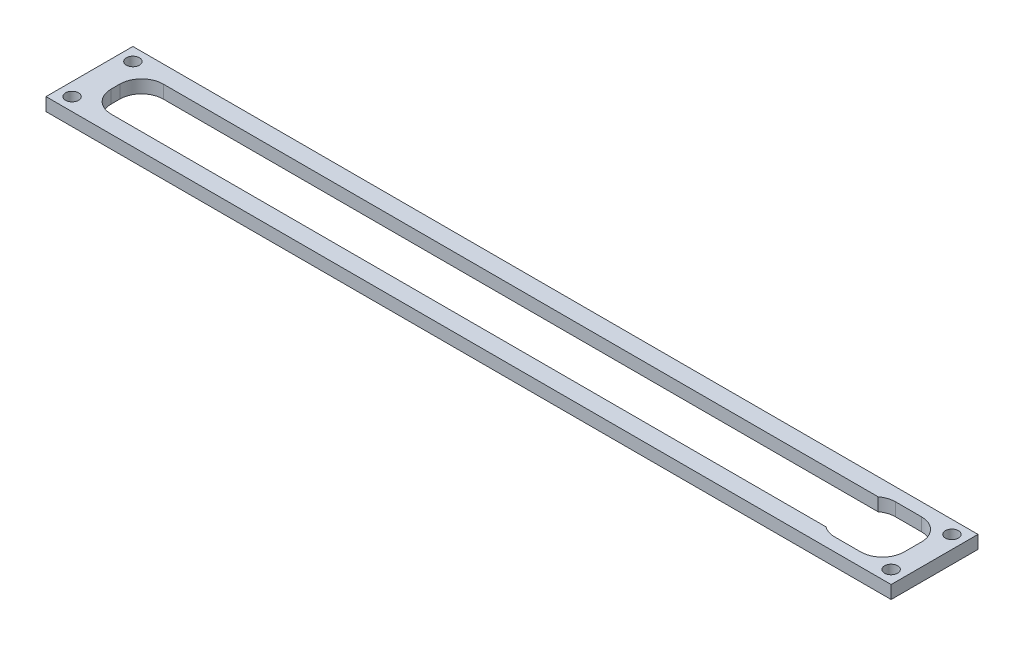
ISO-10303-21;
HEADER;
FILE_DESCRIPTION(('STEP AP214'),'2;1');
FILE_NAME('part.step','',(''),(''),'','','');
FILE_SCHEMA(('AUTOMOTIVE_DESIGN { 1 0 10303 214 1 1 1 1 }'));
ENDSEC;
DATA;
#1=APPLICATION_CONTEXT('core data for automotive mechanical design processes');
#2=APPLICATION_PROTOCOL_DEFINITION('international standard','automotive_design',2000,#1);
#3=PRODUCT_CONTEXT('',#1,'mechanical');
#4=PRODUCT('Part','Part','',(#3));
#5=PRODUCT_RELATED_PRODUCT_CATEGORY('part','',(#4));
#6=PRODUCT_DEFINITION_FORMATION('','',#4);
#7=PRODUCT_DEFINITION_CONTEXT('part definition',#1,'design');
#8=PRODUCT_DEFINITION('design','',#6,#7);
#9=PRODUCT_DEFINITION_SHAPE('','',#8);
#10=(LENGTH_UNIT() NAMED_UNIT(*) SI_UNIT(.MILLI.,.METRE.));
#11=(NAMED_UNIT(*) PLANE_ANGLE_UNIT() SI_UNIT($,.RADIAN.));
#12=(NAMED_UNIT(*) SI_UNIT($,.STERADIAN.) SOLID_ANGLE_UNIT());
#13=UNCERTAINTY_MEASURE_WITH_UNIT(LENGTH_MEASURE(1.E-05),#10,'distance_accuracy_value','');
#14=(GEOMETRIC_REPRESENTATION_CONTEXT(3) GLOBAL_UNCERTAINTY_ASSIGNED_CONTEXT((#13)) GLOBAL_UNIT_ASSIGNED_CONTEXT((#10,
#11,#12)) REPRESENTATION_CONTEXT('',''));
#15=CARTESIAN_POINT('',(0.,0.,0.));
#16=DIRECTION('',(0.,0.,1.));
#17=DIRECTION('',(1.,0.,0.));
#18=AXIS2_PLACEMENT_3D('',#15,#16,#17);
#19=CARTESIAN_POINT('',(0.,3.,0.));
#20=DIRECTION('',(0.,-1.,0.));
#21=DIRECTION('',(0.,0.,-1.));
#22=AXIS2_PLACEMENT_3D('',#19,#20,#21);
#23=PLANE('',#22);
#24=DIRECTION('',(0.,0.,1.));
#25=VECTOR('',#24,1.);
#26=CARTESIAN_POINT('',(0.,3.,0.));
#27=LINE('',#26,#25);
#28=CARTESIAN_POINT('',(0.,3.,-20.));
#29=VERTEX_POINT('',#28);
#30=CARTESIAN_POINT('',(0.,3.,0.));
#31=VERTEX_POINT('',#30);
#32=EDGE_CURVE('E252',#29,#31,#27,.T.);
#33=ORIENTED_EDGE('',*,*,#32,.T.);
#34=DIRECTION('',(1.,0.,0.));
#35=VECTOR('',#34,1.);
#36=CARTESIAN_POINT('',(0.,3.,0.));
#37=LINE('',#36,#35);
#38=CARTESIAN_POINT('',(194.591670796805,3.,0.));
#39=VERTEX_POINT('',#38);
#40=EDGE_CURVE('E255',#31,#39,#37,.T.);
#41=ORIENTED_EDGE('',*,*,#40,.T.);
#42=DIRECTION('',(0.,0.,-1.));
#43=VECTOR('',#42,1.);
#44=CARTESIAN_POINT('',(194.591670796805,3.,0.));
#45=LINE('',#44,#43);
#46=CARTESIAN_POINT('',(194.591670796805,3.,-20.));
#47=VERTEX_POINT('',#46);
#48=EDGE_CURVE('E258',#39,#47,#45,.T.);
#49=ORIENTED_EDGE('',*,*,#48,.T.);
#50=DIRECTION('',(-1.,0.,0.));
#51=VECTOR('',#50,1.);
#52=CARTESIAN_POINT('',(0.,3.,-20.));
#53=LINE('',#52,#51);
#54=EDGE_CURVE('E260',#47,#29,#53,.T.);
#55=ORIENTED_EDGE('',*,*,#54,.T.);
#56=EDGE_LOOP('',(#33,#41,#49,#55));
#57=FACE_BOUND('',#56,.T.);
#58=DIRECTION('',(-1.,0.,0.));
#59=VECTOR('',#58,1.);
#60=CARTESIAN_POINT('',(5.99999999999999,3.,-16.));
#61=LINE('',#60,#59);
#62=CARTESIAN_POINT('',(175.591670796805,3.,-16.));
#63=VERTEX_POINT('',#62);
#64=CARTESIAN_POINT('',(11.,3.,-16.));
#65=VERTEX_POINT('',#64);
#66=EDGE_CURVE('E245',#63,#65,#61,.T.);
#67=ORIENTED_EDGE('',*,*,#66,.F.);
#68=CARTESIAN_POINT('',(178.591670796805,3.,-12.));
#69=DIRECTION('',(0.,-1.,0.));
#70=DIRECTION('',(0.,0.,-1.));
#71=AXIS2_PLACEMENT_3D('',#68,#69,#70);
#72=CIRCLE('',#71,5.);
#73=CARTESIAN_POINT('',(178.591670796805,3.,-17.));
#74=VERTEX_POINT('',#73);
#75=EDGE_CURVE('E195',#63,#74,#72,.T.);
#76=ORIENTED_EDGE('',*,*,#75,.T.);
#77=DIRECTION('',(-1.,0.,0.));
#78=VECTOR('',#77,1.);
#79=CARTESIAN_POINT('',(175.591670796805,3.,-17.));
#80=LINE('',#79,#78);
#81=CARTESIAN_POINT('',(184.591670796805,3.,-17.));
#82=VERTEX_POINT('',#81);
#83=EDGE_CURVE('E207',#82,#74,#80,.T.);
#84=ORIENTED_EDGE('',*,*,#83,.F.);
#85=CARTESIAN_POINT('',(184.591670796805,3.,-12.));
#86=DIRECTION('',(0.,-1.,0.));
#87=DIRECTION('',(0.,0.,-1.));
#88=AXIS2_PLACEMENT_3D('',#85,#86,#87);
#89=CIRCLE('',#88,5.);
#90=CARTESIAN_POINT('',(189.591670796805,3.,-12.));
#91=VERTEX_POINT('',#90);
#92=EDGE_CURVE('E187',#82,#91,#89,.T.);
#93=ORIENTED_EDGE('',*,*,#92,.T.);
#94=DIRECTION('',(0.,0.,-1.));
#95=VECTOR('',#94,1.);
#96=CARTESIAN_POINT('',(189.591670796805,3.,-17.));
#97=LINE('',#96,#95);
#98=CARTESIAN_POINT('',(189.591670796805,3.,-8.00000000000001));
#99=VERTEX_POINT('',#98);
#100=EDGE_CURVE('E204',#99,#91,#97,.T.);
#101=ORIENTED_EDGE('',*,*,#100,.F.);
#102=CARTESIAN_POINT('',(184.591670796805,3.,-8.00000000000001));
#103=DIRECTION('',(0.,-1.,0.));
#104=DIRECTION('',(0.,0.,-1.));
#105=AXIS2_PLACEMENT_3D('',#102,#103,#104);
#106=CIRCLE('',#105,5.);
#107=CARTESIAN_POINT('',(184.591670796805,3.,-3.00000000000001));
#108=VERTEX_POINT('',#107);
#109=EDGE_CURVE('E191',#99,#108,#106,.T.);
#110=ORIENTED_EDGE('',*,*,#109,.T.);
#111=DIRECTION('',(1.,0.,0.));
#112=VECTOR('',#111,1.);
#113=CARTESIAN_POINT('',(175.591670796805,3.,-3.00000000000001));
#114=LINE('',#113,#112);
#115=CARTESIAN_POINT('',(178.591670796805,3.,-3.00000000000001));
#116=VERTEX_POINT('',#115);
#117=EDGE_CURVE('E202',#116,#108,#114,.T.);
#118=ORIENTED_EDGE('',*,*,#117,.F.);
#119=CARTESIAN_POINT('',(178.591670796805,3.,-8.00000000000001));
#120=DIRECTION('',(0.,-1.,0.));
#121=DIRECTION('',(0.,0.,-1.));
#122=AXIS2_PLACEMENT_3D('',#119,#120,#121);
#123=CIRCLE('',#122,5.);
#124=CARTESIAN_POINT('',(175.591670796805,3.,-4.00000000000002));
#125=VERTEX_POINT('',#124);
#126=EDGE_CURVE('E45',#116,#125,#123,.T.);
#127=ORIENTED_EDGE('',*,*,#126,.T.);
#128=DIRECTION('',(1.,0.,0.));
#129=VECTOR('',#128,1.);
#130=CARTESIAN_POINT('',(5.99999999999999,3.,-4.00000000000002));
#131=LINE('',#130,#129);
#132=CARTESIAN_POINT('',(11.,3.,-4.00000000000002));
#133=VERTEX_POINT('',#132);
#134=EDGE_CURVE('E164',#133,#125,#131,.T.);
#135=ORIENTED_EDGE('',*,*,#134,.F.);
#136=CARTESIAN_POINT('',(11.,3.,-9.00000000000001));
#137=DIRECTION('',(0.,-1.,0.));
#138=DIRECTION('',(0.,0.,-1.));
#139=AXIS2_PLACEMENT_3D('',#136,#137,#138);
#140=CIRCLE('',#139,5.);
#141=CARTESIAN_POINT('',(5.99999999999999,3.,-9.00000000000001));
#142=VERTEX_POINT('',#141);
#143=EDGE_CURVE('E181',#133,#142,#140,.T.);
#144=ORIENTED_EDGE('',*,*,#143,.T.);
#145=DIRECTION('',(0.,0.,1.));
#146=VECTOR('',#145,1.);
#147=CARTESIAN_POINT('',(5.99999999999999,3.,-16.));
#148=LINE('',#147,#146);
#149=CARTESIAN_POINT('',(5.99999999999999,3.,-11.));
#150=VERTEX_POINT('',#149);
#151=EDGE_CURVE('E241',#150,#142,#148,.T.);
#152=ORIENTED_EDGE('',*,*,#151,.F.);
#153=CARTESIAN_POINT('',(11.,3.,-11.));
#154=DIRECTION('',(0.,-1.,0.));
#155=DIRECTION('',(0.,0.,-1.));
#156=AXIS2_PLACEMENT_3D('',#153,#154,#155);
#157=CIRCLE('',#156,5.);
#158=EDGE_CURVE('E185',#150,#65,#157,.T.);
#159=ORIENTED_EDGE('',*,*,#158,.T.);
#160=EDGE_LOOP('',(#67,#76,#84,#93,#101,#110,#118,#127,#135,#144,#152,#159));
#161=FACE_BOUND('',#160,.T.);
#162=CARTESIAN_POINT('',(3.,3.,-17.));
#163=DIRECTION('',(0.,1.,0.));
#164=DIRECTION('',(0.,0.,1.));
#165=AXIS2_PLACEMENT_3D('',#162,#163,#164);
#166=CIRCLE('',#165,1.5);
#167=CARTESIAN_POINT('',(3.,3.,-15.5));
#168=VERTEX_POINT('',#167);
#169=EDGE_CURVE('E236',#168,#168,#166,.T.);
#170=ORIENTED_EDGE('',*,*,#169,.F.);
#171=EDGE_LOOP('',(#170));
#172=FACE_BOUND('',#171,.T.);
#173=CARTESIAN_POINT('',(3.,3.,-3.));
#174=DIRECTION('',(0.,1.,0.));
#175=DIRECTION('',(0.,0.,-1.));
#176=AXIS2_PLACEMENT_3D('',#173,#174,#175);
#177=CIRCLE('',#176,1.5);
#178=CARTESIAN_POINT('',(3.,3.,-4.5));
#179=VERTEX_POINT('',#178);
#180=EDGE_CURVE('E230',#179,#179,#177,.T.);
#181=ORIENTED_EDGE('',*,*,#180,.F.);
#182=EDGE_LOOP('',(#181));
#183=FACE_BOUND('',#182,.T.);
#184=CARTESIAN_POINT('',(191.591670796805,3.,-3.00000000000002));
#185=DIRECTION('',(0.,1.,0.));
#186=DIRECTION('',(0.,0.,1.));
#187=AXIS2_PLACEMENT_3D('',#184,#185,#186);
#188=CIRCLE('',#187,1.5);
#189=CARTESIAN_POINT('',(191.591670796805,3.,-1.50000000000002));
#190=VERTEX_POINT('',#189);
#191=EDGE_CURVE('E224',#190,#190,#188,.T.);
#192=ORIENTED_EDGE('',*,*,#191,.F.);
#193=EDGE_LOOP('',(#192));
#194=FACE_BOUND('',#193,.T.);
#195=CARTESIAN_POINT('',(191.591670796805,3.,-17.0000000000001));
#196=DIRECTION('',(0.,1.,0.));
#197=DIRECTION('',(0.,0.,-1.));
#198=AXIS2_PLACEMENT_3D('',#195,#196,#197);
#199=CIRCLE('',#198,1.5);
#200=CARTESIAN_POINT('',(191.591670796805,3.,-18.5000000000001));
#201=VERTEX_POINT('',#200);
#202=EDGE_CURVE('E218',#201,#201,#199,.T.);
#203=ORIENTED_EDGE('',*,*,#202,.F.);
#204=EDGE_LOOP('',(#203));
#205=FACE_BOUND('',#204,.T.);
#206=ADVANCED_FACE('F37',(#57,#161,#172,#183,#194,#205),#23,.F.);
#207=CARTESIAN_POINT('',(0.,0.,0.));
#208=DIRECTION('',(0.,-1.,0.));
#209=DIRECTION('',(0.,0.,-1.));
#210=AXIS2_PLACEMENT_3D('',#207,#208,#209);
#211=PLANE('',#210);
#212=DIRECTION('',(-1.,0.,0.));
#213=VECTOR('',#212,1.);
#214=CARTESIAN_POINT('',(175.591670796805,0.,-17.));
#215=LINE('',#214,#213);
#216=CARTESIAN_POINT('',(184.591670796805,0.,-17.));
#217=VERTEX_POINT('',#216);
#218=CARTESIAN_POINT('',(178.591670796805,0.,-17.));
#219=VERTEX_POINT('',#218);
#220=EDGE_CURVE('E167',#217,#219,#215,.T.);
#221=ORIENTED_EDGE('',*,*,#220,.T.);
#222=CARTESIAN_POINT('',(178.591670796805,0.,-12.));
#223=DIRECTION('',(0.,-1.,0.));
#224=DIRECTION('',(0.,0.,-1.));
#225=AXIS2_PLACEMENT_3D('',#222,#223,#224);
#226=CIRCLE('',#225,5.);
#227=CARTESIAN_POINT('',(175.591670796805,0.,-16.));
#228=VERTEX_POINT('',#227);
#229=EDGE_CURVE('E197',#219,#228,#226,.F.);
#230=ORIENTED_EDGE('',*,*,#229,.T.);
#231=DIRECTION('',(-1.,0.,0.));
#232=VECTOR('',#231,1.);
#233=CARTESIAN_POINT('',(5.99999999999999,0.,-16.));
#234=LINE('',#233,#232);
#235=CARTESIAN_POINT('',(11.,0.,-16.));
#236=VERTEX_POINT('',#235);
#237=EDGE_CURVE('E156',#228,#236,#234,.T.);
#238=ORIENTED_EDGE('',*,*,#237,.T.);
#239=CARTESIAN_POINT('',(11.,0.,-11.));
#240=DIRECTION('',(0.,-1.,0.));
#241=DIRECTION('',(0.,0.,-1.));
#242=AXIS2_PLACEMENT_3D('',#239,#240,#241);
#243=CIRCLE('',#242,5.);
#244=CARTESIAN_POINT('',(5.99999999999999,0.,-11.));
#245=VERTEX_POINT('',#244);
#246=EDGE_CURVE('E183',#236,#245,#243,.F.);
#247=ORIENTED_EDGE('',*,*,#246,.T.);
#248=DIRECTION('',(0.,0.,1.));
#249=VECTOR('',#248,1.);
#250=CARTESIAN_POINT('',(5.99999999999999,0.,-16.));
#251=LINE('',#250,#249);
#252=CARTESIAN_POINT('',(5.99999999999999,0.,-9.00000000000001));
#253=VERTEX_POINT('',#252);
#254=EDGE_CURVE('E157',#245,#253,#251,.T.);
#255=ORIENTED_EDGE('',*,*,#254,.T.);
#256=CARTESIAN_POINT('',(11.,0.,-9.00000000000001));
#257=DIRECTION('',(0.,-1.,0.));
#258=DIRECTION('',(0.,0.,-1.));
#259=AXIS2_PLACEMENT_3D('',#256,#257,#258);
#260=CIRCLE('',#259,5.);
#261=CARTESIAN_POINT('',(11.,0.,-4.00000000000002));
#262=VERTEX_POINT('',#261);
#263=EDGE_CURVE('E153',#253,#262,#260,.F.);
#264=ORIENTED_EDGE('',*,*,#263,.T.);
#265=DIRECTION('',(1.,0.,0.));
#266=VECTOR('',#265,1.);
#267=CARTESIAN_POINT('',(5.99999999999999,0.,-4.00000000000002));
#268=LINE('',#267,#266);
#269=CARTESIAN_POINT('',(175.591670796805,0.,-4.00000000000002));
#270=VERTEX_POINT('',#269);
#271=EDGE_CURVE('E147',#262,#270,#268,.T.);
#272=ORIENTED_EDGE('',*,*,#271,.T.);
#273=CARTESIAN_POINT('',(178.591670796805,0.,-8.00000000000001));
#274=DIRECTION('',(0.,-1.,0.));
#275=DIRECTION('',(0.,0.,-1.));
#276=AXIS2_PLACEMENT_3D('',#273,#274,#275);
#277=CIRCLE('',#276,5.);
#278=CARTESIAN_POINT('',(178.591670796805,0.,-3.00000000000001));
#279=VERTEX_POINT('',#278);
#280=EDGE_CURVE('E11',#270,#279,#277,.F.);
#281=ORIENTED_EDGE('',*,*,#280,.T.);
#282=DIRECTION('',(1.,0.,0.));
#283=VECTOR('',#282,1.);
#284=CARTESIAN_POINT('',(175.591670796805,0.,-3.00000000000001));
#285=LINE('',#284,#283);
#286=CARTESIAN_POINT('',(184.591670796805,0.,-3.00000000000001));
#287=VERTEX_POINT('',#286);
#288=EDGE_CURVE('E214',#279,#287,#285,.T.);
#289=ORIENTED_EDGE('',*,*,#288,.T.);
#290=CARTESIAN_POINT('',(184.591670796805,0.,-8.00000000000001));
#291=DIRECTION('',(0.,-1.,0.));
#292=DIRECTION('',(0.,0.,-1.));
#293=AXIS2_PLACEMENT_3D('',#290,#291,#292);
#294=CIRCLE('',#293,5.);
#295=CARTESIAN_POINT('',(189.591670796805,0.,-8.00000000000001));
#296=VERTEX_POINT('',#295);
#297=EDGE_CURVE('E193',#287,#296,#294,.F.);
#298=ORIENTED_EDGE('',*,*,#297,.T.);
#299=DIRECTION('',(0.,0.,-1.));
#300=VECTOR('',#299,1.);
#301=CARTESIAN_POINT('',(189.591670796805,0.,-17.));
#302=LINE('',#301,#300);
#303=CARTESIAN_POINT('',(189.591670796805,0.,-12.));
#304=VERTEX_POINT('',#303);
#305=EDGE_CURVE('E302',#296,#304,#302,.T.);
#306=ORIENTED_EDGE('',*,*,#305,.T.);
#307=CARTESIAN_POINT('',(184.591670796805,0.,-12.));
#308=DIRECTION('',(0.,-1.,0.));
#309=DIRECTION('',(0.,0.,-1.));
#310=AXIS2_PLACEMENT_3D('',#307,#308,#309);
#311=CIRCLE('',#310,5.);
#312=EDGE_CURVE('E189',#304,#217,#311,.F.);
#313=ORIENTED_EDGE('',*,*,#312,.T.);
#314=EDGE_LOOP('',(#221,#230,#238,#247,#255,#264,#272,#281,#289,#298,#306,#313));
#315=FACE_BOUND('',#314,.T.);
#316=CARTESIAN_POINT('',(191.591670796805,0.,-3.00000000000002));
#317=DIRECTION('',(0.,1.,0.));
#318=DIRECTION('',(0.,0.,1.));
#319=AXIS2_PLACEMENT_3D('',#316,#317,#318);
#320=CIRCLE('',#319,1.5);
#321=CARTESIAN_POINT('',(191.591670796805,0.,-1.50000000000002));
#322=VERTEX_POINT('',#321);
#323=EDGE_CURVE('E221',#322,#322,#320,.T.);
#324=ORIENTED_EDGE('',*,*,#323,.T.);
#325=EDGE_LOOP('',(#324));
#326=FACE_BOUND('',#325,.T.);
#327=CARTESIAN_POINT('',(3.,0.,-17.));
#328=DIRECTION('',(0.,1.,0.));
#329=DIRECTION('',(0.,0.,1.));
#330=AXIS2_PLACEMENT_3D('',#327,#328,#329);
#331=CIRCLE('',#330,1.5);
#332=CARTESIAN_POINT('',(3.,0.,-15.5));
#333=VERTEX_POINT('',#332);
#334=EDGE_CURVE('E233',#333,#333,#331,.T.);
#335=ORIENTED_EDGE('',*,*,#334,.T.);
#336=EDGE_LOOP('',(#335));
#337=FACE_BOUND('',#336,.T.);
#338=DIRECTION('',(0.,0.,1.));
#339=VECTOR('',#338,1.);
#340=CARTESIAN_POINT('',(0.,0.,0.));
#341=LINE('',#340,#339);
#342=CARTESIAN_POINT('',(0.,0.,-20.));
#343=VERTEX_POINT('',#342);
#344=CARTESIAN_POINT('',(0.,0.,0.));
#345=VERTEX_POINT('',#344);
#346=EDGE_CURVE('E248',#343,#345,#341,.T.);
#347=ORIENTED_EDGE('',*,*,#346,.F.);
#348=DIRECTION('',(-1.,0.,0.));
#349=VECTOR('',#348,1.);
#350=CARTESIAN_POINT('',(0.,0.,-20.));
#351=LINE('',#350,#349);
#352=CARTESIAN_POINT('',(194.591670796805,0.,-20.));
#353=VERTEX_POINT('',#352);
#354=EDGE_CURVE('E256',#353,#343,#351,.T.);
#355=ORIENTED_EDGE('',*,*,#354,.F.);
#356=DIRECTION('',(0.,0.,-1.));
#357=VECTOR('',#356,1.);
#358=CARTESIAN_POINT('',(194.591670796805,0.,0.));
#359=LINE('',#358,#357);
#360=CARTESIAN_POINT('',(194.591670796805,0.,0.));
#361=VERTEX_POINT('',#360);
#362=EDGE_CURVE('E267',#361,#353,#359,.T.);
#363=ORIENTED_EDGE('',*,*,#362,.F.);
#364=DIRECTION('',(1.,0.,0.));
#365=VECTOR('',#364,1.);
#366=CARTESIAN_POINT('',(0.,0.,0.));
#367=LINE('',#366,#365);
#368=EDGE_CURVE('E265',#345,#361,#367,.T.);
#369=ORIENTED_EDGE('',*,*,#368,.F.);
#370=EDGE_LOOP('',(#347,#355,#363,#369));
#371=FACE_BOUND('',#370,.T.);
#372=CARTESIAN_POINT('',(3.,0.,-3.));
#373=DIRECTION('',(0.,1.,0.));
#374=DIRECTION('',(0.,0.,-1.));
#375=AXIS2_PLACEMENT_3D('',#372,#373,#374);
#376=CIRCLE('',#375,1.5);
#377=CARTESIAN_POINT('',(3.,0.,-4.5));
#378=VERTEX_POINT('',#377);
#379=EDGE_CURVE('E227',#378,#378,#376,.T.);
#380=ORIENTED_EDGE('',*,*,#379,.T.);
#381=EDGE_LOOP('',(#380));
#382=FACE_BOUND('',#381,.T.);
#383=CARTESIAN_POINT('',(191.591670796805,0.,-17.0000000000001));
#384=DIRECTION('',(0.,1.,0.));
#385=DIRECTION('',(0.,0.,-1.));
#386=AXIS2_PLACEMENT_3D('',#383,#384,#385);
#387=CIRCLE('',#386,1.5);
#388=CARTESIAN_POINT('',(191.591670796805,0.,-18.5000000000001));
#389=VERTEX_POINT('',#388);
#390=EDGE_CURVE('E216',#389,#389,#387,.T.);
#391=ORIENTED_EDGE('',*,*,#390,.T.);
#392=EDGE_LOOP('',(#391));
#393=FACE_BOUND('',#392,.T.);
#394=ADVANCED_FACE('F150',(#315,#326,#337,#371,#382,#393),#211,.T.);
#395=CARTESIAN_POINT('',(0.,3.,0.));
#396=DIRECTION('',(1.,0.,0.));
#397=DIRECTION('',(0.,0.,-1.));
#398=AXIS2_PLACEMENT_3D('',#395,#396,#397);
#399=PLANE('',#398);
#400=ORIENTED_EDGE('',*,*,#346,.T.);
#401=DIRECTION('',(0.,-1.,0.));
#402=VECTOR('',#401,1.);
#403=CARTESIAN_POINT('',(0.,3.,0.));
#404=LINE('',#403,#402);
#405=EDGE_CURVE('E278',#31,#345,#404,.T.);
#406=ORIENTED_EDGE('',*,*,#405,.F.);
#407=ORIENTED_EDGE('',*,*,#32,.F.);
#408=DIRECTION('',(0.,-1.,0.));
#409=VECTOR('',#408,1.);
#410=CARTESIAN_POINT('',(0.,3.,-20.));
#411=LINE('',#410,#409);
#412=EDGE_CURVE('E262',#29,#343,#411,.T.);
#413=ORIENTED_EDGE('',*,*,#412,.T.);
#414=EDGE_LOOP('',(#400,#406,#407,#413));
#415=FACE_BOUND('',#414,.T.);
#416=ADVANCED_FACE('F333',(#415),#399,.F.);
#417=CARTESIAN_POINT('',(0.,3.,0.));
#418=DIRECTION('',(0.,0.,-1.));
#419=DIRECTION('',(-1.,0.,0.));
#420=AXIS2_PLACEMENT_3D('',#417,#418,#419);
#421=PLANE('',#420);
#422=ORIENTED_EDGE('',*,*,#368,.T.);
#423=DIRECTION('',(0.,-1.,0.));
#424=VECTOR('',#423,1.);
#425=CARTESIAN_POINT('',(194.591670796805,3.,0.));
#426=LINE('',#425,#424);
#427=EDGE_CURVE('E275',#39,#361,#426,.T.);
#428=ORIENTED_EDGE('',*,*,#427,.F.);
#429=ORIENTED_EDGE('',*,*,#40,.F.);
#430=ORIENTED_EDGE('',*,*,#405,.T.);
#431=EDGE_LOOP('',(#422,#428,#429,#430));
#432=FACE_BOUND('',#431,.T.);
#433=ADVANCED_FACE('F346',(#432),#421,.F.);
#434=CARTESIAN_POINT('',(194.591670796805,3.,0.));
#435=DIRECTION('',(-1.,0.,0.));
#436=DIRECTION('',(0.,0.,1.));
#437=AXIS2_PLACEMENT_3D('',#434,#435,#436);
#438=PLANE('',#437);
#439=ORIENTED_EDGE('',*,*,#362,.T.);
#440=DIRECTION('',(0.,-1.,0.));
#441=VECTOR('',#440,1.);
#442=CARTESIAN_POINT('',(194.591670796805,3.,-20.));
#443=LINE('',#442,#441);
#444=EDGE_CURVE('E272',#47,#353,#443,.T.);
#445=ORIENTED_EDGE('',*,*,#444,.F.);
#446=ORIENTED_EDGE('',*,*,#48,.F.);
#447=ORIENTED_EDGE('',*,*,#427,.T.);
#448=EDGE_LOOP('',(#439,#445,#446,#447));
#449=FACE_BOUND('',#448,.T.);
#450=ADVANCED_FACE('F342',(#449),#438,.F.);
#451=CARTESIAN_POINT('',(0.,3.,-20.));
#452=DIRECTION('',(0.,0.,1.));
#453=DIRECTION('',(1.,0.,0.));
#454=AXIS2_PLACEMENT_3D('',#451,#452,#453);
#455=PLANE('',#454);
#456=ORIENTED_EDGE('',*,*,#354,.T.);
#457=ORIENTED_EDGE('',*,*,#412,.F.);
#458=ORIENTED_EDGE('',*,*,#54,.F.);
#459=ORIENTED_EDGE('',*,*,#444,.T.);
#460=EDGE_LOOP('',(#456,#457,#458,#459));
#461=FACE_BOUND('',#460,.T.);
#462=ADVANCED_FACE('F339',(#461),#455,.F.);
#463=CARTESIAN_POINT('',(5.99999999999999,3.,-16.));
#464=DIRECTION('',(1.,0.,0.));
#465=DIRECTION('',(0.,0.,-1.));
#466=AXIS2_PLACEMENT_3D('',#463,#464,#465);
#467=PLANE('',#466);
#468=ORIENTED_EDGE('',*,*,#151,.T.);
#469=DIRECTION('',(0.,-1.,0.));
#470=VECTOR('',#469,1.);
#471=CARTESIAN_POINT('',(5.99999999999999,0.,-9.00000000000001));
#472=LINE('',#471,#470);
#473=EDGE_CURVE('E283',#142,#253,#472,.T.);
#474=ORIENTED_EDGE('',*,*,#473,.T.);
#475=ORIENTED_EDGE('',*,*,#254,.F.);
#476=DIRECTION('',(0.,-1.,0.));
#477=VECTOR('',#476,1.);
#478=CARTESIAN_POINT('',(5.99999999999999,3.,-11.));
#479=LINE('',#478,#477);
#480=EDGE_CURVE('E281',#245,#150,#479,.F.);
#481=ORIENTED_EDGE('',*,*,#480,.T.);
#482=EDGE_LOOP('',(#468,#474,#475,#481));
#483=FACE_BOUND('',#482,.T.);
#484=ADVANCED_FACE('F336',(#483),#467,.T.);
#485=CARTESIAN_POINT('',(5.99999999999999,3.,-4.00000000000002));
#486=DIRECTION('',(0.,0.,-1.));
#487=DIRECTION('',(-1.,0.,0.));
#488=AXIS2_PLACEMENT_3D('',#485,#486,#487);
#489=PLANE('',#488);
#490=ORIENTED_EDGE('',*,*,#271,.F.);
#491=DIRECTION('',(0.,-1.,0.));
#492=VECTOR('',#491,1.);
#493=CARTESIAN_POINT('',(11.,3.,-4.00000000000002));
#494=LINE('',#493,#492);
#495=EDGE_CURVE('E286',#262,#133,#494,.F.);
#496=ORIENTED_EDGE('',*,*,#495,.T.);
#497=ORIENTED_EDGE('',*,*,#134,.T.);
#498=DIRECTION('',(0.,1.,0.));
#499=VECTOR('',#498,1.);
#500=CARTESIAN_POINT('',(175.591670796805,0.,-4.00000000000002));
#501=LINE('',#500,#499);
#502=EDGE_CURVE('E161',#270,#125,#501,.T.);
#503=ORIENTED_EDGE('',*,*,#502,.F.);
#504=EDGE_LOOP('',(#490,#496,#497,#503));
#505=FACE_BOUND('',#504,.T.);
#506=ADVANCED_FACE('F162',(#505),#489,.T.);
#507=CARTESIAN_POINT('',(5.99999999999999,3.,-16.));
#508=DIRECTION('',(0.,0.,1.));
#509=DIRECTION('',(1.,0.,0.));
#510=AXIS2_PLACEMENT_3D('',#507,#508,#509);
#511=PLANE('',#510);
#512=ORIENTED_EDGE('',*,*,#66,.T.);
#513=DIRECTION('',(0.,-1.,0.));
#514=VECTOR('',#513,1.);
#515=CARTESIAN_POINT('',(11.,0.,-16.));
#516=LINE('',#515,#514);
#517=EDGE_CURVE('E288',#65,#236,#516,.T.);
#518=ORIENTED_EDGE('',*,*,#517,.T.);
#519=ORIENTED_EDGE('',*,*,#237,.F.);
#520=DIRECTION('',(0.,1.,0.));
#521=VECTOR('',#520,1.);
#522=CARTESIAN_POINT('',(175.591670796805,0.,-16.));
#523=LINE('',#522,#521);
#524=EDGE_CURVE('E166',#228,#63,#523,.T.);
#525=ORIENTED_EDGE('',*,*,#524,.T.);
#526=EDGE_LOOP('',(#512,#518,#519,#525));
#527=FACE_BOUND('',#526,.T.);
#528=ADVANCED_FACE('F368',(#527),#511,.T.);
#529=CARTESIAN_POINT('',(3.,3.,-17.));
#530=DIRECTION('',(0.,-1.,0.));
#531=DIRECTION('',(0.,0.,-1.));
#532=AXIS2_PLACEMENT_3D('',#529,#530,#531);
#533=CYLINDRICAL_SURFACE('',#532,1.5);
#534=ORIENTED_EDGE('',*,*,#169,.T.);
#535=EDGE_LOOP('',(#534));
#536=FACE_BOUND('',#535,.T.);
#537=ORIENTED_EDGE('',*,*,#334,.F.);
#538=EDGE_LOOP('',(#537));
#539=FACE_BOUND('',#538,.T.);
#540=ADVANCED_FACE('F381',(#536,#539),#533,.F.);
#541=CARTESIAN_POINT('',(3.,3.,-3.));
#542=DIRECTION('',(0.,-1.,0.));
#543=DIRECTION('',(0.,0.,-1.));
#544=AXIS2_PLACEMENT_3D('',#541,#542,#543);
#545=CYLINDRICAL_SURFACE('',#544,1.5);
#546=ORIENTED_EDGE('',*,*,#180,.T.);
#547=EDGE_LOOP('',(#546));
#548=FACE_BOUND('',#547,.T.);
#549=ORIENTED_EDGE('',*,*,#379,.F.);
#550=EDGE_LOOP('',(#549));
#551=FACE_BOUND('',#550,.T.);
#552=ADVANCED_FACE('F386',(#548,#551),#545,.F.);
#553=CARTESIAN_POINT('',(191.591670796805,3.,-3.00000000000002));
#554=DIRECTION('',(0.,-1.,0.));
#555=DIRECTION('',(0.,0.,-1.));
#556=AXIS2_PLACEMENT_3D('',#553,#554,#555);
#557=CYLINDRICAL_SURFACE('',#556,1.5);
#558=ORIENTED_EDGE('',*,*,#191,.T.);
#559=EDGE_LOOP('',(#558));
#560=FACE_BOUND('',#559,.T.);
#561=ORIENTED_EDGE('',*,*,#323,.F.);
#562=EDGE_LOOP('',(#561));
#563=FACE_BOUND('',#562,.T.);
#564=ADVANCED_FACE('F390',(#560,#563),#557,.F.);
#565=CARTESIAN_POINT('',(191.591670796805,3.,-17.0000000000001));
#566=DIRECTION('',(0.,-1.,0.));
#567=DIRECTION('',(0.,0.,-1.));
#568=AXIS2_PLACEMENT_3D('',#565,#566,#567);
#569=CYLINDRICAL_SURFACE('',#568,1.5);
#570=ORIENTED_EDGE('',*,*,#202,.T.);
#571=EDGE_LOOP('',(#570));
#572=FACE_BOUND('',#571,.T.);
#573=ORIENTED_EDGE('',*,*,#390,.F.);
#574=EDGE_LOOP('',(#573));
#575=FACE_BOUND('',#574,.T.);
#576=ADVANCED_FACE('F394',(#572,#575),#569,.F.);
#577=CARTESIAN_POINT('',(175.591670796805,0.,-17.));
#578=DIRECTION('',(0.,0.,-1.));
#579=DIRECTION('',(-1.,0.,0.));
#580=AXIS2_PLACEMENT_3D('',#577,#578,#579);
#581=PLANE('',#580);
#582=ORIENTED_EDGE('',*,*,#220,.F.);
#583=DIRECTION('',(0.,1.,0.));
#584=VECTOR('',#583,1.);
#585=CARTESIAN_POINT('',(184.591670796805,3.,-17.));
#586=LINE('',#585,#584);
#587=EDGE_CURVE('E293',#217,#82,#586,.T.);
#588=ORIENTED_EDGE('',*,*,#587,.T.);
#589=ORIENTED_EDGE('',*,*,#83,.T.);
#590=DIRECTION('',(0.,1.,0.));
#591=VECTOR('',#590,1.);
#592=CARTESIAN_POINT('',(178.591670796805,0.,-17.));
#593=LINE('',#592,#591);
#594=EDGE_CURVE('E291',#74,#219,#593,.F.);
#595=ORIENTED_EDGE('',*,*,#594,.T.);
#596=EDGE_LOOP('',(#582,#588,#589,#595));
#597=FACE_BOUND('',#596,.T.);
#598=ADVANCED_FACE('F312',(#597),#581,.F.);
#599=CARTESIAN_POINT('',(189.591670796805,0.,-17.));
#600=DIRECTION('',(1.,0.,0.));
#601=DIRECTION('',(0.,0.,-1.));
#602=AXIS2_PLACEMENT_3D('',#599,#600,#601);
#603=PLANE('',#602);
#604=ORIENTED_EDGE('',*,*,#100,.T.);
#605=DIRECTION('',(0.,1.,0.));
#606=VECTOR('',#605,1.);
#607=CARTESIAN_POINT('',(189.591670796805,0.,-12.));
#608=LINE('',#607,#606);
#609=EDGE_CURVE('E173',#91,#304,#608,.F.);
#610=ORIENTED_EDGE('',*,*,#609,.T.);
#611=ORIENTED_EDGE('',*,*,#305,.F.);
#612=DIRECTION('',(0.,1.,0.));
#613=VECTOR('',#612,1.);
#614=CARTESIAN_POINT('',(189.591670796805,3.,-8.00000000000001));
#615=LINE('',#614,#613);
#616=EDGE_CURVE('E176',#296,#99,#615,.T.);
#617=ORIENTED_EDGE('',*,*,#616,.T.);
#618=EDGE_LOOP('',(#604,#610,#611,#617));
#619=FACE_BOUND('',#618,.T.);
#620=ADVANCED_FACE('F299',(#619),#603,.F.);
#621=CARTESIAN_POINT('',(175.591670796805,0.,-3.00000000000001));
#622=DIRECTION('',(0.,0.,1.));
#623=DIRECTION('',(1.,0.,0.));
#624=AXIS2_PLACEMENT_3D('',#621,#622,#623);
#625=PLANE('',#624);
#626=ORIENTED_EDGE('',*,*,#117,.T.);
#627=DIRECTION('',(0.,1.,0.));
#628=VECTOR('',#627,1.);
#629=CARTESIAN_POINT('',(184.591670796805,0.,-3.00000000000001));
#630=LINE('',#629,#628);
#631=EDGE_CURVE('E52',#108,#287,#630,.F.);
#632=ORIENTED_EDGE('',*,*,#631,.T.);
#633=ORIENTED_EDGE('',*,*,#288,.F.);
#634=DIRECTION('',(0.,-1.,0.));
#635=VECTOR('',#634,1.);
#636=CARTESIAN_POINT('',(178.591670796805,0.,-3.00000000000001));
#637=LINE('',#636,#635);
#638=EDGE_CURVE('E171',#279,#116,#637,.F.);
#639=ORIENTED_EDGE('',*,*,#638,.T.);
#640=EDGE_LOOP('',(#626,#632,#633,#639));
#641=FACE_BOUND('',#640,.T.);
#642=ADVANCED_FACE('F357',(#641),#625,.F.);
#643=CARTESIAN_POINT('',(11.,3.,-9.00000000000001));
#644=DIRECTION('',(0.,1.,0.));
#645=DIRECTION('',(0.,0.,1.));
#646=AXIS2_PLACEMENT_3D('',#643,#644,#645);
#647=CYLINDRICAL_SURFACE('',#646,5.);
#648=ORIENTED_EDGE('',*,*,#143,.F.);
#649=ORIENTED_EDGE('',*,*,#495,.F.);
#650=ORIENTED_EDGE('',*,*,#263,.F.);
#651=ORIENTED_EDGE('',*,*,#473,.F.);
#652=EDGE_LOOP('',(#648,#649,#650,#651));
#653=FACE_BOUND('',#652,.T.);
#654=ADVANCED_FACE('F354',(#653),#647,.F.);
#655=CARTESIAN_POINT('',(11.,3.,-11.));
#656=DIRECTION('',(0.,1.,0.));
#657=DIRECTION('',(0.,0.,1.));
#658=AXIS2_PLACEMENT_3D('',#655,#656,#657);
#659=CYLINDRICAL_SURFACE('',#658,5.);
#660=ORIENTED_EDGE('',*,*,#158,.F.);
#661=ORIENTED_EDGE('',*,*,#480,.F.);
#662=ORIENTED_EDGE('',*,*,#246,.F.);
#663=ORIENTED_EDGE('',*,*,#517,.F.);
#664=EDGE_LOOP('',(#660,#661,#662,#663));
#665=FACE_BOUND('',#664,.T.);
#666=ADVANCED_FACE('F325',(#665),#659,.F.);
#667=CARTESIAN_POINT('',(184.591670796805,0.,-12.));
#668=DIRECTION('',(0.,-1.,0.));
#669=DIRECTION('',(0.,0.,-1.));
#670=AXIS2_PLACEMENT_3D('',#667,#668,#669);
#671=CYLINDRICAL_SURFACE('',#670,5.);
#672=ORIENTED_EDGE('',*,*,#312,.F.);
#673=ORIENTED_EDGE('',*,*,#609,.F.);
#674=ORIENTED_EDGE('',*,*,#92,.F.);
#675=ORIENTED_EDGE('',*,*,#587,.F.);
#676=EDGE_LOOP('',(#672,#673,#674,#675));
#677=FACE_BOUND('',#676,.T.);
#678=ADVANCED_FACE('F309',(#677),#671,.F.);
#679=CARTESIAN_POINT('',(184.591670796805,0.,-8.00000000000001));
#680=DIRECTION('',(0.,-1.,0.));
#681=DIRECTION('',(0.,0.,-1.));
#682=AXIS2_PLACEMENT_3D('',#679,#680,#681);
#683=CYLINDRICAL_SURFACE('',#682,5.);
#684=ORIENTED_EDGE('',*,*,#297,.F.);
#685=ORIENTED_EDGE('',*,*,#631,.F.);
#686=ORIENTED_EDGE('',*,*,#109,.F.);
#687=ORIENTED_EDGE('',*,*,#616,.F.);
#688=EDGE_LOOP('',(#684,#685,#686,#687));
#689=FACE_BOUND('',#688,.T.);
#690=ADVANCED_FACE('F316',(#689),#683,.F.);
#691=CARTESIAN_POINT('',(178.591670796805,0.,-12.));
#692=DIRECTION('',(0.,1.,0.));
#693=DIRECTION('',(0.,0.,1.));
#694=AXIS2_PLACEMENT_3D('',#691,#692,#693);
#695=CYLINDRICAL_SURFACE('',#694,5.);
#696=ORIENTED_EDGE('',*,*,#229,.F.);
#697=ORIENTED_EDGE('',*,*,#594,.F.);
#698=ORIENTED_EDGE('',*,*,#75,.F.);
#699=ORIENTED_EDGE('',*,*,#524,.F.);
#700=EDGE_LOOP('',(#696,#697,#698,#699));
#701=FACE_BOUND('',#700,.T.);
#702=ADVANCED_FACE('F318',(#701),#695,.F.);
#703=CARTESIAN_POINT('',(178.591670796805,0.,-8.00000000000001));
#704=DIRECTION('',(0.,-1.,0.));
#705=DIRECTION('',(0.,0.,-1.));
#706=AXIS2_PLACEMENT_3D('',#703,#704,#705);
#707=CYLINDRICAL_SURFACE('',#706,5.);
#708=ORIENTED_EDGE('',*,*,#280,.F.);
#709=ORIENTED_EDGE('',*,*,#502,.T.);
#710=ORIENTED_EDGE('',*,*,#126,.F.);
#711=ORIENTED_EDGE('',*,*,#638,.F.);
#712=EDGE_LOOP('',(#708,#709,#710,#711));
#713=FACE_BOUND('',#712,.T.);
#714=ADVANCED_FACE('F39',(#713),#707,.F.);
#715=CLOSED_SHELL('',(#206,#394,#416,#433,#450,#462,#484,#506,#528,#540,#552,#564,#576,#598,
#620,#642,#654,#666,#678,#690,#702,#714));
#716=MANIFOLD_SOLID_BREP('B2',#715);
#717=ADVANCED_BREP_SHAPE_REPRESENTATION('',(#18,#716),#14);
#718=SHAPE_DEFINITION_REPRESENTATION(#9,#717);
ENDSEC;
END-ISO-10303-21;
